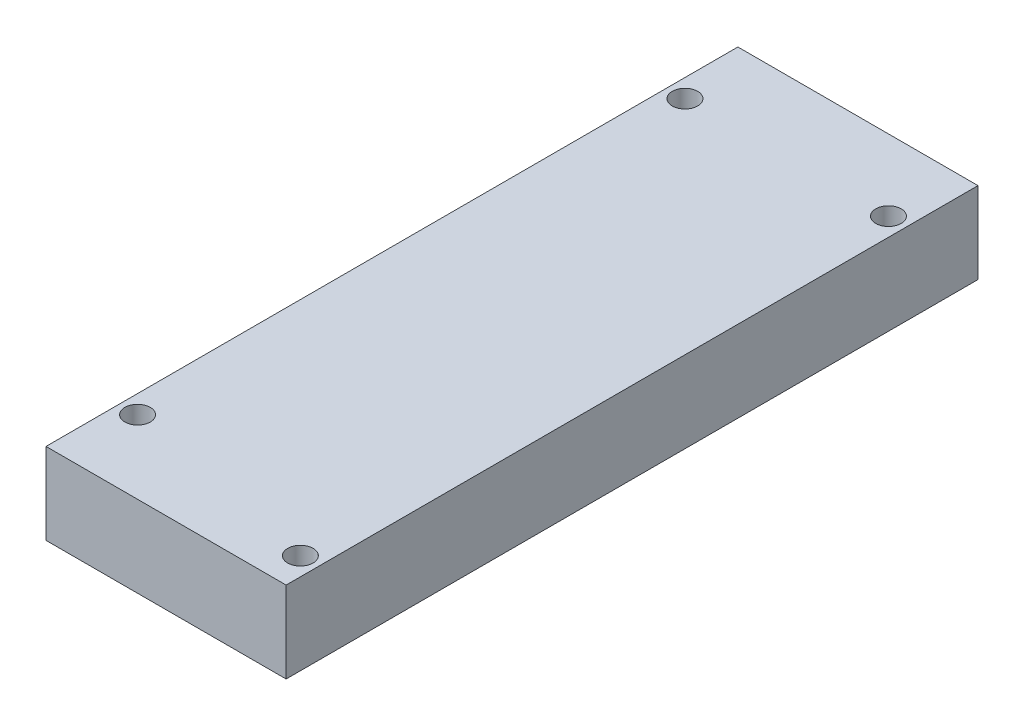
ISO-10303-21;
HEADER;
FILE_DESCRIPTION(('STEP AP214'),'2;1');
FILE_NAME('part.step','',(''),(''),'','','');
FILE_SCHEMA(('AUTOMOTIVE_DESIGN { 1 0 10303 214 1 1 1 1 }'));
ENDSEC;
DATA;
#1=APPLICATION_CONTEXT('core data for automotive mechanical design processes');
#2=APPLICATION_PROTOCOL_DEFINITION('international standard','automotive_design',2000,#1);
#3=PRODUCT_CONTEXT('',#1,'mechanical');
#4=PRODUCT('Part','Part','',(#3));
#5=PRODUCT_RELATED_PRODUCT_CATEGORY('part','',(#4));
#6=PRODUCT_DEFINITION_FORMATION('','',#4);
#7=PRODUCT_DEFINITION_CONTEXT('part definition',#1,'design');
#8=PRODUCT_DEFINITION('design','',#6,#7);
#9=PRODUCT_DEFINITION_SHAPE('','',#8);
#10=(LENGTH_UNIT() NAMED_UNIT(*) SI_UNIT(.MILLI.,.METRE.));
#11=(NAMED_UNIT(*) PLANE_ANGLE_UNIT() SI_UNIT($,.RADIAN.));
#12=(NAMED_UNIT(*) SI_UNIT($,.STERADIAN.) SOLID_ANGLE_UNIT());
#13=UNCERTAINTY_MEASURE_WITH_UNIT(LENGTH_MEASURE(1.E-05),#10,'distance_accuracy_value','');
#14=(GEOMETRIC_REPRESENTATION_CONTEXT(3) GLOBAL_UNCERTAINTY_ASSIGNED_CONTEXT((#13)) GLOBAL_UNIT_ASSIGNED_CONTEXT((#10,
#11,#12)) REPRESENTATION_CONTEXT('',''));
#15=CARTESIAN_POINT('',(0.,0.,0.));
#16=DIRECTION('',(0.,0.,1.));
#17=DIRECTION('',(1.,0.,0.));
#18=AXIS2_PLACEMENT_3D('',#15,#16,#17);
#19=CARTESIAN_POINT('',(-12.1622149837134,1.68781758957654,86.36));
#20=DIRECTION('',(1.,0.,0.));
#21=DIRECTION('',(0.,1.,0.));
#22=AXIS2_PLACEMENT_3D('',#19,#20,#21);
#23=PLANE('',#22);
#24=DIRECTION('',(0.,-1.,0.));
#25=VECTOR('',#24,1.);
#26=CARTESIAN_POINT('',(-12.1622149837134,1.68781758957654,0.));
#27=LINE('',#26,#25);
#28=CARTESIAN_POINT('',(-12.1622149837134,1.68781758957654,0.));
#29=VERTEX_POINT('',#28);
#30=CARTESIAN_POINT('',(-12.1622149837134,-8.47218241042346,0.));
#31=VERTEX_POINT('',#30);
#32=EDGE_CURVE('E107',#29,#31,#27,.T.);
#33=ORIENTED_EDGE('',*,*,#32,.T.);
#34=DIRECTION('',(0.,0.,-1.));
#35=VECTOR('',#34,1.);
#36=CARTESIAN_POINT('',(-12.1622149837134,-8.47218241042346,86.36));
#37=LINE('',#36,#35);
#38=CARTESIAN_POINT('',(-12.1622149837134,-8.47218241042346,86.36));
#39=VERTEX_POINT('',#38);
#40=EDGE_CURVE('E11',#39,#31,#37,.T.);
#41=ORIENTED_EDGE('',*,*,#40,.F.);
#42=DIRECTION('',(0.,-1.,0.));
#43=VECTOR('',#42,1.);
#44=CARTESIAN_POINT('',(-12.1622149837134,1.68781758957654,86.36));
#45=LINE('',#44,#43);
#46=CARTESIAN_POINT('',(-12.1622149837134,1.68781758957654,86.36));
#47=VERTEX_POINT('',#46);
#48=EDGE_CURVE('E91',#47,#39,#45,.T.);
#49=ORIENTED_EDGE('',*,*,#48,.F.);
#50=DIRECTION('',(0.,0.,-1.));
#51=VECTOR('',#50,1.);
#52=CARTESIAN_POINT('',(-12.1622149837134,1.68781758957654,86.36));
#53=LINE('',#52,#51);
#54=EDGE_CURVE('E103',#47,#29,#53,.T.);
#55=ORIENTED_EDGE('',*,*,#54,.T.);
#56=EDGE_LOOP('',(#33,#41,#49,#55));
#57=FACE_BOUND('',#56,.T.);
#58=ADVANCED_FACE('F39',(#57),#23,.F.);
#59=CARTESIAN_POINT('',(-12.1622149837134,-8.47218241042346,86.36));
#60=DIRECTION('',(0.,1.,0.));
#61=DIRECTION('',(0.,0.,1.));
#62=AXIS2_PLACEMENT_3D('',#59,#60,#61);
#63=PLANE('',#62);
#64=CARTESIAN_POINT('',(15.5237850162866,-8.47218241042346,82.296));
#65=DIRECTION('',(0.,1.,0.));
#66=DIRECTION('',(0.,0.,1.));
#67=AXIS2_PLACEMENT_3D('',#64,#65,#66);
#68=CIRCLE('',#67,1.5875);
#69=CARTESIAN_POINT('',(15.5237850162866,-8.47218241042346,83.8835));
#70=VERTEX_POINT('',#69);
#71=EDGE_CURVE('E111',#70,#70,#68,.T.);
#72=ORIENTED_EDGE('',*,*,#71,.T.);
#73=EDGE_LOOP('',(#72));
#74=FACE_BOUND('',#73,.T.);
#75=CARTESIAN_POINT('',(-9.87621498371336,-8.47218241042346,77.216));
#76=DIRECTION('',(0.,1.,0.));
#77=DIRECTION('',(0.,0.,1.));
#78=AXIS2_PLACEMENT_3D('',#75,#76,#77);
#79=CIRCLE('',#78,1.5875);
#80=CARTESIAN_POINT('',(-9.87621498371336,-8.47218241042346,78.8035));
#81=VERTEX_POINT('',#80);
#82=EDGE_CURVE('E131',#81,#81,#79,.T.);
#83=ORIENTED_EDGE('',*,*,#82,.T.);
#84=EDGE_LOOP('',(#83));
#85=FACE_BOUND('',#84,.T.);
#86=CARTESIAN_POINT('',(15.5237850162866,-8.47218241042346,8.89));
#87=DIRECTION('',(0.,1.,0.));
#88=DIRECTION('',(0.,0.,1.));
#89=AXIS2_PLACEMENT_3D('',#86,#87,#88);
#90=CIRCLE('',#89,1.5875);
#91=CARTESIAN_POINT('',(15.5237850162866,-8.47218241042346,10.4775));
#92=VERTEX_POINT('',#91);
#93=EDGE_CURVE('E135',#92,#92,#90,.T.);
#94=ORIENTED_EDGE('',*,*,#93,.T.);
#95=EDGE_LOOP('',(#94));
#96=FACE_BOUND('',#95,.T.);
#97=CARTESIAN_POINT('',(-9.87621498371336,-8.47218241042346,8.89));
#98=DIRECTION('',(0.,1.,0.));
#99=DIRECTION('',(0.,0.,1.));
#100=AXIS2_PLACEMENT_3D('',#97,#98,#99);
#101=CIRCLE('',#100,1.5875);
#102=CARTESIAN_POINT('',(-9.87621498371336,-8.47218241042346,10.4775));
#103=VERTEX_POINT('',#102);
#104=EDGE_CURVE('E139',#103,#103,#101,.T.);
#105=ORIENTED_EDGE('',*,*,#104,.T.);
#106=EDGE_LOOP('',(#105));
#107=FACE_BOUND('',#106,.T.);
#108=DIRECTION('',(1.,0.,0.));
#109=VECTOR('',#108,1.);
#110=CARTESIAN_POINT('',(-12.1622149837134,-8.47218241042346,0.));
#111=LINE('',#110,#109);
#112=CARTESIAN_POINT('',(17.8097850162866,-8.47218241042346,0.));
#113=VERTEX_POINT('',#112);
#114=EDGE_CURVE('E96',#31,#113,#111,.T.);
#115=ORIENTED_EDGE('',*,*,#114,.T.);
#116=DIRECTION('',(0.,0.,-1.));
#117=VECTOR('',#116,1.);
#118=CARTESIAN_POINT('',(17.8097850162866,-8.47218241042346,86.36));
#119=LINE('',#118,#117);
#120=CARTESIAN_POINT('',(17.8097850162866,-8.47218241042346,86.36));
#121=VERTEX_POINT('',#120);
#122=EDGE_CURVE('E48',#121,#113,#119,.T.);
#123=ORIENTED_EDGE('',*,*,#122,.F.);
#124=DIRECTION('',(1.,0.,0.));
#125=VECTOR('',#124,1.);
#126=CARTESIAN_POINT('',(-12.1622149837134,-8.47218241042346,86.36));
#127=LINE('',#126,#125);
#128=EDGE_CURVE('E86',#39,#121,#127,.T.);
#129=ORIENTED_EDGE('',*,*,#128,.F.);
#130=ORIENTED_EDGE('',*,*,#40,.T.);
#131=EDGE_LOOP('',(#115,#123,#129,#130));
#132=FACE_BOUND('',#131,.T.);
#133=ADVANCED_FACE('F95',(#74,#85,#96,#107,#132),#63,.F.);
#134=CARTESIAN_POINT('',(17.8097850162866,1.68781758957654,86.36));
#135=DIRECTION('',(-1.,0.,0.));
#136=DIRECTION('',(0.,0.,1.));
#137=AXIS2_PLACEMENT_3D('',#134,#135,#136);
#138=PLANE('',#137);
#139=DIRECTION('',(0.,1.,0.));
#140=VECTOR('',#139,1.);
#141=CARTESIAN_POINT('',(17.8097850162866,1.68781758957654,0.));
#142=LINE('',#141,#140);
#143=CARTESIAN_POINT('',(17.8097850162866,1.68781758957654,0.));
#144=VERTEX_POINT('',#143);
#145=EDGE_CURVE('E73',#113,#144,#142,.T.);
#146=ORIENTED_EDGE('',*,*,#145,.T.);
#147=DIRECTION('',(0.,0.,-1.));
#148=VECTOR('',#147,1.);
#149=CARTESIAN_POINT('',(17.8097850162866,1.68781758957654,86.36));
#150=LINE('',#149,#148);
#151=CARTESIAN_POINT('',(17.8097850162866,1.68781758957654,86.36));
#152=VERTEX_POINT('',#151);
#153=EDGE_CURVE('E98',#152,#144,#150,.T.);
#154=ORIENTED_EDGE('',*,*,#153,.F.);
#155=DIRECTION('',(0.,1.,0.));
#156=VECTOR('',#155,1.);
#157=CARTESIAN_POINT('',(17.8097850162866,1.68781758957654,86.36));
#158=LINE('',#157,#156);
#159=EDGE_CURVE('E89',#121,#152,#158,.T.);
#160=ORIENTED_EDGE('',*,*,#159,.F.);
#161=ORIENTED_EDGE('',*,*,#122,.T.);
#162=EDGE_LOOP('',(#146,#154,#160,#161));
#163=FACE_BOUND('',#162,.T.);
#164=ADVANCED_FACE('F99',(#163),#138,.F.);
#165=CARTESIAN_POINT('',(-12.1622149837134,1.68781758957654,86.36));
#166=DIRECTION('',(0.,-1.,0.));
#167=DIRECTION('',(0.,0.,-1.));
#168=AXIS2_PLACEMENT_3D('',#165,#166,#167);
#169=PLANE('',#168);
#170=CARTESIAN_POINT('',(15.5237850162866,1.68781758957654,82.296));
#171=DIRECTION('',(0.,1.,0.));
#172=DIRECTION('',(0.,0.,1.));
#173=AXIS2_PLACEMENT_3D('',#170,#171,#172);
#174=CIRCLE('',#173,1.5875);
#175=CARTESIAN_POINT('',(15.5237850162866,1.68781758957654,83.8835));
#176=VERTEX_POINT('',#175);
#177=EDGE_CURVE('E148',#176,#176,#174,.T.);
#178=ORIENTED_EDGE('',*,*,#177,.F.);
#179=EDGE_LOOP('',(#178));
#180=FACE_BOUND('',#179,.T.);
#181=CARTESIAN_POINT('',(-9.87621498371336,1.68781758957654,77.216));
#182=DIRECTION('',(0.,1.,0.));
#183=DIRECTION('',(0.,0.,1.));
#184=AXIS2_PLACEMENT_3D('',#181,#182,#183);
#185=CIRCLE('',#184,1.5875);
#186=CARTESIAN_POINT('',(-9.87621498371336,1.68781758957654,78.8035));
#187=VERTEX_POINT('',#186);
#188=EDGE_CURVE('E152',#187,#187,#185,.T.);
#189=ORIENTED_EDGE('',*,*,#188,.F.);
#190=EDGE_LOOP('',(#189));
#191=FACE_BOUND('',#190,.T.);
#192=CARTESIAN_POINT('',(15.5237850162866,1.68781758957654,8.89));
#193=DIRECTION('',(0.,1.,0.));
#194=DIRECTION('',(0.,0.,1.));
#195=AXIS2_PLACEMENT_3D('',#192,#193,#194);
#196=CIRCLE('',#195,1.5875);
#197=CARTESIAN_POINT('',(15.5237850162866,1.68781758957654,10.4775));
#198=VERTEX_POINT('',#197);
#199=EDGE_CURVE('E147',#198,#198,#196,.T.);
#200=ORIENTED_EDGE('',*,*,#199,.F.);
#201=EDGE_LOOP('',(#200));
#202=FACE_BOUND('',#201,.T.);
#203=CARTESIAN_POINT('',(-9.87621498371336,1.68781758957654,8.89));
#204=DIRECTION('',(0.,1.,0.));
#205=DIRECTION('',(0.,0.,1.));
#206=AXIS2_PLACEMENT_3D('',#203,#204,#205);
#207=CIRCLE('',#206,1.5875);
#208=CARTESIAN_POINT('',(-9.87621498371336,1.68781758957654,10.4775));
#209=VERTEX_POINT('',#208);
#210=EDGE_CURVE('E143',#209,#209,#207,.T.);
#211=ORIENTED_EDGE('',*,*,#210,.F.);
#212=EDGE_LOOP('',(#211));
#213=FACE_BOUND('',#212,.T.);
#214=DIRECTION('',(-1.,0.,0.));
#215=VECTOR('',#214,1.);
#216=CARTESIAN_POINT('',(-12.1622149837134,1.68781758957654,0.));
#217=LINE('',#216,#215);
#218=EDGE_CURVE('E79',#144,#29,#217,.T.);
#219=ORIENTED_EDGE('',*,*,#218,.T.);
#220=ORIENTED_EDGE('',*,*,#54,.F.);
#221=DIRECTION('',(-1.,0.,0.));
#222=VECTOR('',#221,1.);
#223=CARTESIAN_POINT('',(-12.1622149837134,1.68781758957654,86.36));
#224=LINE('',#223,#222);
#225=EDGE_CURVE('E56',#152,#47,#224,.T.);
#226=ORIENTED_EDGE('',*,*,#225,.F.);
#227=ORIENTED_EDGE('',*,*,#153,.T.);
#228=EDGE_LOOP('',(#219,#220,#226,#227));
#229=FACE_BOUND('',#228,.T.);
#230=ADVANCED_FACE('F121',(#180,#191,#202,#213,#229),#169,.F.);
#231=CARTESIAN_POINT('',(0.,0.,86.36));
#232=DIRECTION('',(0.,0.,1.));
#233=DIRECTION('',(1.,0.,0.));
#234=AXIS2_PLACEMENT_3D('',#231,#232,#233);
#235=PLANE('',#234);
#236=ORIENTED_EDGE('',*,*,#48,.T.);
#237=ORIENTED_EDGE('',*,*,#128,.T.);
#238=ORIENTED_EDGE('',*,*,#159,.T.);
#239=ORIENTED_EDGE('',*,*,#225,.T.);
#240=EDGE_LOOP('',(#236,#237,#238,#239));
#241=FACE_BOUND('',#240,.T.);
#242=ADVANCED_FACE('F87',(#241),#235,.T.);
#243=CARTESIAN_POINT('',(0.,0.,0.));
#244=DIRECTION('',(0.,0.,1.));
#245=DIRECTION('',(1.,0.,0.));
#246=AXIS2_PLACEMENT_3D('',#243,#244,#245);
#247=PLANE('',#246);
#248=ORIENTED_EDGE('',*,*,#32,.F.);
#249=ORIENTED_EDGE('',*,*,#218,.F.);
#250=ORIENTED_EDGE('',*,*,#145,.F.);
#251=ORIENTED_EDGE('',*,*,#114,.F.);
#252=EDGE_LOOP('',(#248,#249,#250,#251));
#253=FACE_BOUND('',#252,.T.);
#254=ADVANCED_FACE('F124',(#253),#247,.F.);
#255=CARTESIAN_POINT('',(-9.87621498371336,-11.0121824104235,8.89));
#256=DIRECTION('',(0.,1.,0.));
#257=DIRECTION('',(0.,0.,1.));
#258=AXIS2_PLACEMENT_3D('',#255,#256,#257);
#259=CYLINDRICAL_SURFACE('',#258,1.5875);
#260=CARTESIAN_POINT('',(-9.87621498371336,1.68781758957654,10.4775));
#261=CARTESIAN_POINT('',(-9.87621498371336,1.58198425624321,10.4775));
#262=CARTESIAN_POINT('',(-9.87621498371336,1.47615092290988,10.4775));
#263=CARTESIAN_POINT('',(-9.87621498371336,1.26448425624321,10.4775));
#264=CARTESIAN_POINT('',(-9.87621498371336,1.15865092290988,10.4775));
#265=CARTESIAN_POINT('',(-9.87621498371336,0.94698425624321,10.4775));
#266=CARTESIAN_POINT('',(-9.87621498371336,0.841150922909876,10.4775));
#267=CARTESIAN_POINT('',(-9.87621498371336,0.62948425624321,10.4775));
#268=CARTESIAN_POINT('',(-9.87621498371336,0.523650922909876,10.4775));
#269=CARTESIAN_POINT('',(-9.87621498371336,0.31198425624321,10.4775));
#270=CARTESIAN_POINT('',(-9.87621498371336,0.206150922909876,10.4775));
#271=CARTESIAN_POINT('',(-9.87621498371336,-0.00551574375679048,10.4775));
#272=CARTESIAN_POINT('',(-9.87621498371336,-0.111349077090124,10.4775));
#273=CARTESIAN_POINT('',(-9.87621498371336,-0.32301574375679,10.4775));
#274=CARTESIAN_POINT('',(-9.87621498371336,-0.428849077090124,10.4775));
#275=CARTESIAN_POINT('',(-9.87621498371336,-0.640515743756791,10.4775));
#276=CARTESIAN_POINT('',(-9.87621498371336,-0.746349077090124,10.4775));
#277=CARTESIAN_POINT('',(-9.87621498371336,-0.958015743756791,10.4775));
#278=CARTESIAN_POINT('',(-9.87621498371336,-1.06384907709012,10.4775));
#279=CARTESIAN_POINT('',(-9.87621498371336,-1.27551574375679,10.4775));
#280=CARTESIAN_POINT('',(-9.87621498371336,-1.38134907709012,10.4775));
#281=CARTESIAN_POINT('',(-9.87621498371336,-1.59301574375679,10.4775));
#282=CARTESIAN_POINT('',(-9.87621498371336,-1.69884907709012,10.4775));
#283=CARTESIAN_POINT('',(-9.87621498371336,-1.91051574375679,10.4775));
#284=CARTESIAN_POINT('',(-9.87621498371336,-2.01634907709012,10.4775));
#285=CARTESIAN_POINT('',(-9.87621498371336,-2.22801574375679,10.4775));
#286=CARTESIAN_POINT('',(-9.87621498371336,-2.33384907709012,10.4775));
#287=CARTESIAN_POINT('',(-9.87621498371336,-2.54551574375679,10.4775));
#288=CARTESIAN_POINT('',(-9.87621498371336,-2.65134907709012,10.4775));
#289=CARTESIAN_POINT('',(-9.87621498371336,-2.86301574375679,10.4775));
#290=CARTESIAN_POINT('',(-9.87621498371336,-2.96884907709012,10.4775));
#291=CARTESIAN_POINT('',(-9.87621498371336,-3.18051574375679,10.4775));
#292=CARTESIAN_POINT('',(-9.87621498371336,-3.28634907709012,10.4775));
#293=CARTESIAN_POINT('',(-9.87621498371336,-3.49801574375679,10.4775));
#294=CARTESIAN_POINT('',(-9.87621498371336,-3.60384907709012,10.4775));
#295=CARTESIAN_POINT('',(-9.87621498371336,-3.81551574375679,10.4775));
#296=CARTESIAN_POINT('',(-9.87621498371336,-3.92134907709012,10.4775));
#297=CARTESIAN_POINT('',(-9.87621498371336,-4.13301574375679,10.4775));
#298=CARTESIAN_POINT('',(-9.87621498371336,-4.23884907709012,10.4775));
#299=CARTESIAN_POINT('',(-9.87621498371336,-4.45051574375679,10.4775));
#300=CARTESIAN_POINT('',(-9.87621498371336,-4.55634907709012,10.4775));
#301=CARTESIAN_POINT('',(-9.87621498371336,-4.76801574375679,10.4775));
#302=CARTESIAN_POINT('',(-9.87621498371336,-4.87384907709012,10.4775));
#303=CARTESIAN_POINT('',(-9.87621498371336,-5.08551574375679,10.4775));
#304=CARTESIAN_POINT('',(-9.87621498371336,-5.19134907709012,10.4775));
#305=CARTESIAN_POINT('',(-9.87621498371336,-5.40301574375679,10.4775));
#306=CARTESIAN_POINT('',(-9.87621498371336,-5.50884907709012,10.4775));
#307=CARTESIAN_POINT('',(-9.87621498371336,-5.72051574375679,10.4775));
#308=CARTESIAN_POINT('',(-9.87621498371336,-5.82634907709012,10.4775));
#309=CARTESIAN_POINT('',(-9.87621498371336,-6.03801574375679,10.4775));
#310=CARTESIAN_POINT('',(-9.87621498371336,-6.14384907709012,10.4775));
#311=CARTESIAN_POINT('',(-9.87621498371336,-6.35551574375679,10.4775));
#312=CARTESIAN_POINT('',(-9.87621498371336,-6.46134907709012,10.4775));
#313=CARTESIAN_POINT('',(-9.87621498371336,-6.67301574375679,10.4775));
#314=CARTESIAN_POINT('',(-9.87621498371336,-6.77884907709012,10.4775));
#315=CARTESIAN_POINT('',(-9.87621498371336,-6.99051574375679,10.4775));
#316=CARTESIAN_POINT('',(-9.87621498371336,-7.09634907709012,10.4775));
#317=CARTESIAN_POINT('',(-9.87621498371336,-7.30801574375679,10.4775));
#318=CARTESIAN_POINT('',(-9.87621498371336,-7.41384907709012,10.4775));
#319=CARTESIAN_POINT('',(-9.87621498371336,-7.62551574375679,10.4775));
#320=CARTESIAN_POINT('',(-9.87621498371336,-7.73134907709012,10.4775));
#321=CARTESIAN_POINT('',(-9.87621498371336,-7.94301574375679,10.4775));
#322=CARTESIAN_POINT('',(-9.87621498371336,-8.04884907709013,10.4775));
#323=CARTESIAN_POINT('',(-9.87621498371336,-8.26051574375679,10.4775));
#324=CARTESIAN_POINT('',(-9.87621498371336,-8.36634907709012,10.4775));
#325=CARTESIAN_POINT('',(-9.87621498371336,-8.47218241042346,10.4775));
#326=B_SPLINE_CURVE_WITH_KNOTS('',3,(#260,#261,#262,#263,#264,#265,#266,#267,#268,#269,#270,
#271,#272,#273,#274,#275,#276,#277,#278,#279,#280,#281,#282,#283,#284,#285,#286,#287,#288,#289,
#290,#291,#292,#293,#294,#295,#296,#297,#298,#299,#300,#301,#302,#303,#304,#305,#306,#307,#308,
#309,#310,#311,#312,#313,#314,#315,#316,#317,#318,#319,#320,#321,#322,#323,#324,#325),
.UNSPECIFIED.,.F.,.F.,(4,2,2,2,2,2,2,2,2,2,2,2,2,2,2,2,2,2,2,2,2,2,2,2,2,2,2,2,2,2,2,2,4),(0.,
0.3175,0.635,0.9525,1.27,1.5875,1.905,2.2225,2.54,2.8575,3.175,3.4925,3.81,4.1275,4.445,4.7625,
5.08,5.3975,5.715,6.0325,6.35,6.6675,6.985,7.3025,7.62,7.9375,8.255,8.5725,8.89,9.2075,9.525,
9.8425,10.16),.UNSPECIFIED.);
#327=EDGE_CURVE('BSEAM169',#209,#103,#326,.T.);
#328=ORIENTED_EDGE('',*,*,#210,.T.);
#329=ORIENTED_EDGE('',*,*,#104,.F.);
#330=ORIENTED_EDGE('',*,*,#327,.T.);
#331=ORIENTED_EDGE('',*,*,#327,.F.);
#332=EDGE_LOOP('',(#328,#330,#329,#331));
#333=FACE_BOUND('',#332,.T.);
#334=ADVANCED_FACE('F169',(#333),#259,.F.);
#335=CARTESIAN_POINT('',(15.5237850162866,-11.0121824104235,8.89));
#336=DIRECTION('',(0.,1.,0.));
#337=DIRECTION('',(0.,0.,1.));
#338=AXIS2_PLACEMENT_3D('',#335,#336,#337);
#339=CYLINDRICAL_SURFACE('',#338,1.5875);
#340=CARTESIAN_POINT('',(15.5237850162866,1.68781758957654,10.4775));
#341=CARTESIAN_POINT('',(15.5237850162866,1.58198425624321,10.4775));
#342=CARTESIAN_POINT('',(15.5237850162866,1.47615092290988,10.4775));
#343=CARTESIAN_POINT('',(15.5237850162866,1.26448425624321,10.4775));
#344=CARTESIAN_POINT('',(15.5237850162866,1.15865092290988,10.4775));
#345=CARTESIAN_POINT('',(15.5237850162866,0.94698425624321,10.4775));
#346=CARTESIAN_POINT('',(15.5237850162866,0.841150922909876,10.4775));
#347=CARTESIAN_POINT('',(15.5237850162866,0.62948425624321,10.4775));
#348=CARTESIAN_POINT('',(15.5237850162866,0.523650922909876,10.4775));
#349=CARTESIAN_POINT('',(15.5237850162866,0.31198425624321,10.4775));
#350=CARTESIAN_POINT('',(15.5237850162866,0.206150922909876,10.4775));
#351=CARTESIAN_POINT('',(15.5237850162866,-0.00551574375679048,10.4775));
#352=CARTESIAN_POINT('',(15.5237850162866,-0.111349077090124,10.4775));
#353=CARTESIAN_POINT('',(15.5237850162866,-0.32301574375679,10.4775));
#354=CARTESIAN_POINT('',(15.5237850162866,-0.428849077090124,10.4775));
#355=CARTESIAN_POINT('',(15.5237850162866,-0.640515743756791,10.4775));
#356=CARTESIAN_POINT('',(15.5237850162866,-0.746349077090124,10.4775));
#357=CARTESIAN_POINT('',(15.5237850162866,-0.958015743756791,10.4775));
#358=CARTESIAN_POINT('',(15.5237850162866,-1.06384907709012,10.4775));
#359=CARTESIAN_POINT('',(15.5237850162866,-1.27551574375679,10.4775));
#360=CARTESIAN_POINT('',(15.5237850162866,-1.38134907709012,10.4775));
#361=CARTESIAN_POINT('',(15.5237850162866,-1.59301574375679,10.4775));
#362=CARTESIAN_POINT('',(15.5237850162866,-1.69884907709012,10.4775));
#363=CARTESIAN_POINT('',(15.5237850162866,-1.91051574375679,10.4775));
#364=CARTESIAN_POINT('',(15.5237850162866,-2.01634907709012,10.4775));
#365=CARTESIAN_POINT('',(15.5237850162866,-2.22801574375679,10.4775));
#366=CARTESIAN_POINT('',(15.5237850162866,-2.33384907709012,10.4775));
#367=CARTESIAN_POINT('',(15.5237850162866,-2.54551574375679,10.4775));
#368=CARTESIAN_POINT('',(15.5237850162866,-2.65134907709012,10.4775));
#369=CARTESIAN_POINT('',(15.5237850162866,-2.86301574375679,10.4775));
#370=CARTESIAN_POINT('',(15.5237850162866,-2.96884907709012,10.4775));
#371=CARTESIAN_POINT('',(15.5237850162866,-3.18051574375679,10.4775));
#372=CARTESIAN_POINT('',(15.5237850162866,-3.28634907709012,10.4775));
#373=CARTESIAN_POINT('',(15.5237850162866,-3.49801574375679,10.4775));
#374=CARTESIAN_POINT('',(15.5237850162866,-3.60384907709012,10.4775));
#375=CARTESIAN_POINT('',(15.5237850162866,-3.81551574375679,10.4775));
#376=CARTESIAN_POINT('',(15.5237850162866,-3.92134907709012,10.4775));
#377=CARTESIAN_POINT('',(15.5237850162866,-4.13301574375679,10.4775));
#378=CARTESIAN_POINT('',(15.5237850162866,-4.23884907709012,10.4775));
#379=CARTESIAN_POINT('',(15.5237850162866,-4.45051574375679,10.4775));
#380=CARTESIAN_POINT('',(15.5237850162866,-4.55634907709012,10.4775));
#381=CARTESIAN_POINT('',(15.5237850162866,-4.76801574375679,10.4775));
#382=CARTESIAN_POINT('',(15.5237850162866,-4.87384907709012,10.4775));
#383=CARTESIAN_POINT('',(15.5237850162866,-5.08551574375679,10.4775));
#384=CARTESIAN_POINT('',(15.5237850162866,-5.19134907709012,10.4775));
#385=CARTESIAN_POINT('',(15.5237850162866,-5.40301574375679,10.4775));
#386=CARTESIAN_POINT('',(15.5237850162866,-5.50884907709012,10.4775));
#387=CARTESIAN_POINT('',(15.5237850162866,-5.72051574375679,10.4775));
#388=CARTESIAN_POINT('',(15.5237850162866,-5.82634907709012,10.4775));
#389=CARTESIAN_POINT('',(15.5237850162866,-6.03801574375679,10.4775));
#390=CARTESIAN_POINT('',(15.5237850162866,-6.14384907709012,10.4775));
#391=CARTESIAN_POINT('',(15.5237850162866,-6.35551574375679,10.4775));
#392=CARTESIAN_POINT('',(15.5237850162866,-6.46134907709012,10.4775));
#393=CARTESIAN_POINT('',(15.5237850162866,-6.67301574375679,10.4775));
#394=CARTESIAN_POINT('',(15.5237850162866,-6.77884907709012,10.4775));
#395=CARTESIAN_POINT('',(15.5237850162866,-6.99051574375679,10.4775));
#396=CARTESIAN_POINT('',(15.5237850162866,-7.09634907709012,10.4775));
#397=CARTESIAN_POINT('',(15.5237850162866,-7.30801574375679,10.4775));
#398=CARTESIAN_POINT('',(15.5237850162866,-7.41384907709012,10.4775));
#399=CARTESIAN_POINT('',(15.5237850162866,-7.62551574375679,10.4775));
#400=CARTESIAN_POINT('',(15.5237850162866,-7.73134907709012,10.4775));
#401=CARTESIAN_POINT('',(15.5237850162866,-7.94301574375679,10.4775));
#402=CARTESIAN_POINT('',(15.5237850162866,-8.04884907709013,10.4775));
#403=CARTESIAN_POINT('',(15.5237850162866,-8.26051574375679,10.4775));
#404=CARTESIAN_POINT('',(15.5237850162866,-8.36634907709012,10.4775));
#405=CARTESIAN_POINT('',(15.5237850162866,-8.47218241042346,10.4775));
#406=B_SPLINE_CURVE_WITH_KNOTS('',3,(#340,#341,#342,#343,#344,#345,#346,#347,#348,#349,#350,
#351,#352,#353,#354,#355,#356,#357,#358,#359,#360,#361,#362,#363,#364,#365,#366,#367,#368,#369,
#370,#371,#372,#373,#374,#375,#376,#377,#378,#379,#380,#381,#382,#383,#384,#385,#386,#387,#388,
#389,#390,#391,#392,#393,#394,#395,#396,#397,#398,#399,#400,#401,#402,#403,#404,#405),
.UNSPECIFIED.,.F.,.F.,(4,2,2,2,2,2,2,2,2,2,2,2,2,2,2,2,2,2,2,2,2,2,2,2,2,2,2,2,2,2,2,2,4),(0.,
0.3175,0.635,0.9525,1.27,1.5875,1.905,2.2225,2.54,2.8575,3.175,3.4925,3.81,4.1275,4.445,4.7625,
5.08,5.3975,5.715,6.0325,6.35,6.6675,6.985,7.3025,7.62,7.9375,8.255,8.5725,8.89,9.2075,9.525,
9.8425,10.16),.UNSPECIFIED.);
#407=EDGE_CURVE('BSEAM160',#198,#92,#406,.T.);
#408=ORIENTED_EDGE('',*,*,#199,.T.);
#409=ORIENTED_EDGE('',*,*,#93,.F.);
#410=ORIENTED_EDGE('',*,*,#407,.T.);
#411=ORIENTED_EDGE('',*,*,#407,.F.);
#412=EDGE_LOOP('',(#408,#410,#409,#411));
#413=FACE_BOUND('',#412,.T.);
#414=ADVANCED_FACE('F160',(#413),#339,.F.);
#415=CARTESIAN_POINT('',(-9.87621498371336,-11.0121824104235,77.216));
#416=DIRECTION('',(0.,1.,0.));
#417=DIRECTION('',(0.,0.,1.));
#418=AXIS2_PLACEMENT_3D('',#415,#416,#417);
#419=CYLINDRICAL_SURFACE('',#418,1.5875);
#420=CARTESIAN_POINT('',(-9.87621498371336,1.68781758957654,78.8035));
#421=CARTESIAN_POINT('',(-9.87621498371336,1.58198425624321,78.8035));
#422=CARTESIAN_POINT('',(-9.87621498371336,1.47615092290988,78.8035));
#423=CARTESIAN_POINT('',(-9.87621498371336,1.26448425624321,78.8035));
#424=CARTESIAN_POINT('',(-9.87621498371336,1.15865092290988,78.8035));
#425=CARTESIAN_POINT('',(-9.87621498371336,0.94698425624321,78.8035));
#426=CARTESIAN_POINT('',(-9.87621498371336,0.841150922909876,78.8035));
#427=CARTESIAN_POINT('',(-9.87621498371336,0.62948425624321,78.8035));
#428=CARTESIAN_POINT('',(-9.87621498371336,0.523650922909876,78.8035));
#429=CARTESIAN_POINT('',(-9.87621498371336,0.31198425624321,78.8035));
#430=CARTESIAN_POINT('',(-9.87621498371336,0.206150922909876,78.8035));
#431=CARTESIAN_POINT('',(-9.87621498371336,-0.00551574375679048,78.8035));
#432=CARTESIAN_POINT('',(-9.87621498371336,-0.111349077090124,78.8035));
#433=CARTESIAN_POINT('',(-9.87621498371336,-0.32301574375679,78.8035));
#434=CARTESIAN_POINT('',(-9.87621498371336,-0.428849077090124,78.8035));
#435=CARTESIAN_POINT('',(-9.87621498371336,-0.640515743756791,78.8035));
#436=CARTESIAN_POINT('',(-9.87621498371336,-0.746349077090124,78.8035));
#437=CARTESIAN_POINT('',(-9.87621498371336,-0.958015743756791,78.8035));
#438=CARTESIAN_POINT('',(-9.87621498371336,-1.06384907709012,78.8035));
#439=CARTESIAN_POINT('',(-9.87621498371336,-1.27551574375679,78.8035));
#440=CARTESIAN_POINT('',(-9.87621498371336,-1.38134907709012,78.8035));
#441=CARTESIAN_POINT('',(-9.87621498371336,-1.59301574375679,78.8035));
#442=CARTESIAN_POINT('',(-9.87621498371336,-1.69884907709012,78.8035));
#443=CARTESIAN_POINT('',(-9.87621498371336,-1.91051574375679,78.8035));
#444=CARTESIAN_POINT('',(-9.87621498371336,-2.01634907709012,78.8035));
#445=CARTESIAN_POINT('',(-9.87621498371336,-2.22801574375679,78.8035));
#446=CARTESIAN_POINT('',(-9.87621498371336,-2.33384907709012,78.8035));
#447=CARTESIAN_POINT('',(-9.87621498371336,-2.54551574375679,78.8035));
#448=CARTESIAN_POINT('',(-9.87621498371336,-2.65134907709012,78.8035));
#449=CARTESIAN_POINT('',(-9.87621498371336,-2.86301574375679,78.8035));
#450=CARTESIAN_POINT('',(-9.87621498371336,-2.96884907709012,78.8035));
#451=CARTESIAN_POINT('',(-9.87621498371336,-3.18051574375679,78.8035));
#452=CARTESIAN_POINT('',(-9.87621498371336,-3.28634907709012,78.8035));
#453=CARTESIAN_POINT('',(-9.87621498371336,-3.49801574375679,78.8035));
#454=CARTESIAN_POINT('',(-9.87621498371336,-3.60384907709012,78.8035));
#455=CARTESIAN_POINT('',(-9.87621498371336,-3.81551574375679,78.8035));
#456=CARTESIAN_POINT('',(-9.87621498371336,-3.92134907709012,78.8035));
#457=CARTESIAN_POINT('',(-9.87621498371336,-4.13301574375679,78.8035));
#458=CARTESIAN_POINT('',(-9.87621498371336,-4.23884907709012,78.8035));
#459=CARTESIAN_POINT('',(-9.87621498371336,-4.45051574375679,78.8035));
#460=CARTESIAN_POINT('',(-9.87621498371336,-4.55634907709012,78.8035));
#461=CARTESIAN_POINT('',(-9.87621498371336,-4.76801574375679,78.8035));
#462=CARTESIAN_POINT('',(-9.87621498371336,-4.87384907709012,78.8035));
#463=CARTESIAN_POINT('',(-9.87621498371336,-5.08551574375679,78.8035));
#464=CARTESIAN_POINT('',(-9.87621498371336,-5.19134907709012,78.8035));
#465=CARTESIAN_POINT('',(-9.87621498371336,-5.40301574375679,78.8035));
#466=CARTESIAN_POINT('',(-9.87621498371336,-5.50884907709012,78.8035));
#467=CARTESIAN_POINT('',(-9.87621498371336,-5.72051574375679,78.8035));
#468=CARTESIAN_POINT('',(-9.87621498371336,-5.82634907709012,78.8035));
#469=CARTESIAN_POINT('',(-9.87621498371336,-6.03801574375679,78.8035));
#470=CARTESIAN_POINT('',(-9.87621498371336,-6.14384907709012,78.8035));
#471=CARTESIAN_POINT('',(-9.87621498371336,-6.35551574375679,78.8035));
#472=CARTESIAN_POINT('',(-9.87621498371336,-6.46134907709012,78.8035));
#473=CARTESIAN_POINT('',(-9.87621498371336,-6.67301574375679,78.8035));
#474=CARTESIAN_POINT('',(-9.87621498371336,-6.77884907709012,78.8035));
#475=CARTESIAN_POINT('',(-9.87621498371336,-6.99051574375679,78.8035));
#476=CARTESIAN_POINT('',(-9.87621498371336,-7.09634907709012,78.8035));
#477=CARTESIAN_POINT('',(-9.87621498371336,-7.30801574375679,78.8035));
#478=CARTESIAN_POINT('',(-9.87621498371336,-7.41384907709012,78.8035));
#479=CARTESIAN_POINT('',(-9.87621498371336,-7.62551574375679,78.8035));
#480=CARTESIAN_POINT('',(-9.87621498371336,-7.73134907709012,78.8035));
#481=CARTESIAN_POINT('',(-9.87621498371336,-7.94301574375679,78.8035));
#482=CARTESIAN_POINT('',(-9.87621498371336,-8.04884907709013,78.8035));
#483=CARTESIAN_POINT('',(-9.87621498371336,-8.26051574375679,78.8035));
#484=CARTESIAN_POINT('',(-9.87621498371336,-8.36634907709012,78.8035));
#485=CARTESIAN_POINT('',(-9.87621498371336,-8.47218241042346,78.8035));
#486=B_SPLINE_CURVE_WITH_KNOTS('',3,(#420,#421,#422,#423,#424,#425,#426,#427,#428,#429,#430,
#431,#432,#433,#434,#435,#436,#437,#438,#439,#440,#441,#442,#443,#444,#445,#446,#447,#448,#449,
#450,#451,#452,#453,#454,#455,#456,#457,#458,#459,#460,#461,#462,#463,#464,#465,#466,#467,#468,
#469,#470,#471,#472,#473,#474,#475,#476,#477,#478,#479,#480,#481,#482,#483,#484,#485),
.UNSPECIFIED.,.F.,.F.,(4,2,2,2,2,2,2,2,2,2,2,2,2,2,2,2,2,2,2,2,2,2,2,2,2,2,2,2,2,2,2,2,4),(0.,
0.3175,0.635,0.9525,1.27,1.5875,1.905,2.2225,2.54,2.8575,3.175,3.4925,3.81,4.1275,4.445,4.7625,
5.08,5.3975,5.715,6.0325,6.35,6.6675,6.985,7.3025,7.62,7.9375,8.255,8.5725,8.89,9.2075,9.525,
9.8425,10.16),.UNSPECIFIED.);
#487=EDGE_CURVE('BSEAM191',#187,#81,#486,.T.);
#488=ORIENTED_EDGE('',*,*,#188,.T.);
#489=ORIENTED_EDGE('',*,*,#82,.F.);
#490=ORIENTED_EDGE('',*,*,#487,.T.);
#491=ORIENTED_EDGE('',*,*,#487,.F.);
#492=EDGE_LOOP('',(#488,#490,#489,#491));
#493=FACE_BOUND('',#492,.T.);
#494=ADVANCED_FACE('F191',(#493),#419,.F.);
#495=CARTESIAN_POINT('',(15.5237850162866,-11.0121824104235,82.296));
#496=DIRECTION('',(0.,1.,0.));
#497=DIRECTION('',(0.,0.,1.));
#498=AXIS2_PLACEMENT_3D('',#495,#496,#497);
#499=CYLINDRICAL_SURFACE('',#498,1.5875);
#500=CARTESIAN_POINT('',(15.5237850162866,1.68781758957654,83.8835));
#501=CARTESIAN_POINT('',(15.5237850162866,1.58198425624321,83.8835));
#502=CARTESIAN_POINT('',(15.5237850162866,1.47615092290988,83.8835));
#503=CARTESIAN_POINT('',(15.5237850162866,1.26448425624321,83.8835));
#504=CARTESIAN_POINT('',(15.5237850162866,1.15865092290988,83.8835));
#505=CARTESIAN_POINT('',(15.5237850162866,0.94698425624321,83.8835));
#506=CARTESIAN_POINT('',(15.5237850162866,0.841150922909876,83.8835));
#507=CARTESIAN_POINT('',(15.5237850162866,0.62948425624321,83.8835));
#508=CARTESIAN_POINT('',(15.5237850162866,0.523650922909876,83.8835));
#509=CARTESIAN_POINT('',(15.5237850162866,0.31198425624321,83.8835));
#510=CARTESIAN_POINT('',(15.5237850162866,0.206150922909876,83.8835));
#511=CARTESIAN_POINT('',(15.5237850162866,-0.00551574375679048,83.8835));
#512=CARTESIAN_POINT('',(15.5237850162866,-0.111349077090124,83.8835));
#513=CARTESIAN_POINT('',(15.5237850162866,-0.32301574375679,83.8835));
#514=CARTESIAN_POINT('',(15.5237850162866,-0.428849077090124,83.8835));
#515=CARTESIAN_POINT('',(15.5237850162866,-0.640515743756791,83.8835));
#516=CARTESIAN_POINT('',(15.5237850162866,-0.746349077090124,83.8835));
#517=CARTESIAN_POINT('',(15.5237850162866,-0.958015743756791,83.8835));
#518=CARTESIAN_POINT('',(15.5237850162866,-1.06384907709012,83.8835));
#519=CARTESIAN_POINT('',(15.5237850162866,-1.27551574375679,83.8835));
#520=CARTESIAN_POINT('',(15.5237850162866,-1.38134907709012,83.8835));
#521=CARTESIAN_POINT('',(15.5237850162866,-1.59301574375679,83.8835));
#522=CARTESIAN_POINT('',(15.5237850162866,-1.69884907709012,83.8835));
#523=CARTESIAN_POINT('',(15.5237850162866,-1.91051574375679,83.8835));
#524=CARTESIAN_POINT('',(15.5237850162866,-2.01634907709012,83.8835));
#525=CARTESIAN_POINT('',(15.5237850162866,-2.22801574375679,83.8835));
#526=CARTESIAN_POINT('',(15.5237850162866,-2.33384907709012,83.8835));
#527=CARTESIAN_POINT('',(15.5237850162866,-2.54551574375679,83.8835));
#528=CARTESIAN_POINT('',(15.5237850162866,-2.65134907709012,83.8835));
#529=CARTESIAN_POINT('',(15.5237850162866,-2.86301574375679,83.8835));
#530=CARTESIAN_POINT('',(15.5237850162866,-2.96884907709012,83.8835));
#531=CARTESIAN_POINT('',(15.5237850162866,-3.18051574375679,83.8835));
#532=CARTESIAN_POINT('',(15.5237850162866,-3.28634907709012,83.8835));
#533=CARTESIAN_POINT('',(15.5237850162866,-3.49801574375679,83.8835));
#534=CARTESIAN_POINT('',(15.5237850162866,-3.60384907709012,83.8835));
#535=CARTESIAN_POINT('',(15.5237850162866,-3.81551574375679,83.8835));
#536=CARTESIAN_POINT('',(15.5237850162866,-3.92134907709012,83.8835));
#537=CARTESIAN_POINT('',(15.5237850162866,-4.13301574375679,83.8835));
#538=CARTESIAN_POINT('',(15.5237850162866,-4.23884907709012,83.8835));
#539=CARTESIAN_POINT('',(15.5237850162866,-4.45051574375679,83.8835));
#540=CARTESIAN_POINT('',(15.5237850162866,-4.55634907709012,83.8835));
#541=CARTESIAN_POINT('',(15.5237850162866,-4.76801574375679,83.8835));
#542=CARTESIAN_POINT('',(15.5237850162866,-4.87384907709012,83.8835));
#543=CARTESIAN_POINT('',(15.5237850162866,-5.08551574375679,83.8835));
#544=CARTESIAN_POINT('',(15.5237850162866,-5.19134907709012,83.8835));
#545=CARTESIAN_POINT('',(15.5237850162866,-5.40301574375679,83.8835));
#546=CARTESIAN_POINT('',(15.5237850162866,-5.50884907709012,83.8835));
#547=CARTESIAN_POINT('',(15.5237850162866,-5.72051574375679,83.8835));
#548=CARTESIAN_POINT('',(15.5237850162866,-5.82634907709012,83.8835));
#549=CARTESIAN_POINT('',(15.5237850162866,-6.03801574375679,83.8835));
#550=CARTESIAN_POINT('',(15.5237850162866,-6.14384907709012,83.8835));
#551=CARTESIAN_POINT('',(15.5237850162866,-6.35551574375679,83.8835));
#552=CARTESIAN_POINT('',(15.5237850162866,-6.46134907709012,83.8835));
#553=CARTESIAN_POINT('',(15.5237850162866,-6.67301574375679,83.8835));
#554=CARTESIAN_POINT('',(15.5237850162866,-6.77884907709012,83.8835));
#555=CARTESIAN_POINT('',(15.5237850162866,-6.99051574375679,83.8835));
#556=CARTESIAN_POINT('',(15.5237850162866,-7.09634907709012,83.8835));
#557=CARTESIAN_POINT('',(15.5237850162866,-7.30801574375679,83.8835));
#558=CARTESIAN_POINT('',(15.5237850162866,-7.41384907709012,83.8835));
#559=CARTESIAN_POINT('',(15.5237850162866,-7.62551574375679,83.8835));
#560=CARTESIAN_POINT('',(15.5237850162866,-7.73134907709012,83.8835));
#561=CARTESIAN_POINT('',(15.5237850162866,-7.94301574375679,83.8835));
#562=CARTESIAN_POINT('',(15.5237850162866,-8.04884907709013,83.8835));
#563=CARTESIAN_POINT('',(15.5237850162866,-8.26051574375679,83.8835));
#564=CARTESIAN_POINT('',(15.5237850162866,-8.36634907709012,83.8835));
#565=CARTESIAN_POINT('',(15.5237850162866,-8.47218241042346,83.8835));
#566=B_SPLINE_CURVE_WITH_KNOTS('',3,(#500,#501,#502,#503,#504,#505,#506,#507,#508,#509,#510,
#511,#512,#513,#514,#515,#516,#517,#518,#519,#520,#521,#522,#523,#524,#525,#526,#527,#528,#529,
#530,#531,#532,#533,#534,#535,#536,#537,#538,#539,#540,#541,#542,#543,#544,#545,#546,#547,#548,
#549,#550,#551,#552,#553,#554,#555,#556,#557,#558,#559,#560,#561,#562,#563,#564,#565),
.UNSPECIFIED.,.F.,.F.,(4,2,2,2,2,2,2,2,2,2,2,2,2,2,2,2,2,2,2,2,2,2,2,2,2,2,2,2,2,2,2,2,4),(0.,
0.3175,0.635,0.9525,1.27,1.5875,1.905,2.2225,2.54,2.8575,3.175,3.4925,3.81,4.1275,4.445,4.7625,
5.08,5.3975,5.715,6.0325,6.35,6.6675,6.985,7.3025,7.62,7.9375,8.255,8.5725,8.89,9.2075,9.525,
9.8425,10.16),.UNSPECIFIED.);
#567=EDGE_CURVE('BSEAM188',#176,#70,#566,.T.);
#568=ORIENTED_EDGE('',*,*,#177,.T.);
#569=ORIENTED_EDGE('',*,*,#71,.F.);
#570=ORIENTED_EDGE('',*,*,#567,.T.);
#571=ORIENTED_EDGE('',*,*,#567,.F.);
#572=EDGE_LOOP('',(#568,#570,#569,#571));
#573=FACE_BOUND('',#572,.T.);
#574=ADVANCED_FACE('F188',(#573),#499,.F.);
#575=CLOSED_SHELL('',(#58,#133,#164,#230,#242,#254,#334,#414,#494,#574));
#576=MANIFOLD_SOLID_BREP('B2',#575);
#577=ADVANCED_BREP_SHAPE_REPRESENTATION('',(#18,#576),#14);
#578=SHAPE_DEFINITION_REPRESENTATION(#9,#577);
ENDSEC;
END-ISO-10303-21;
